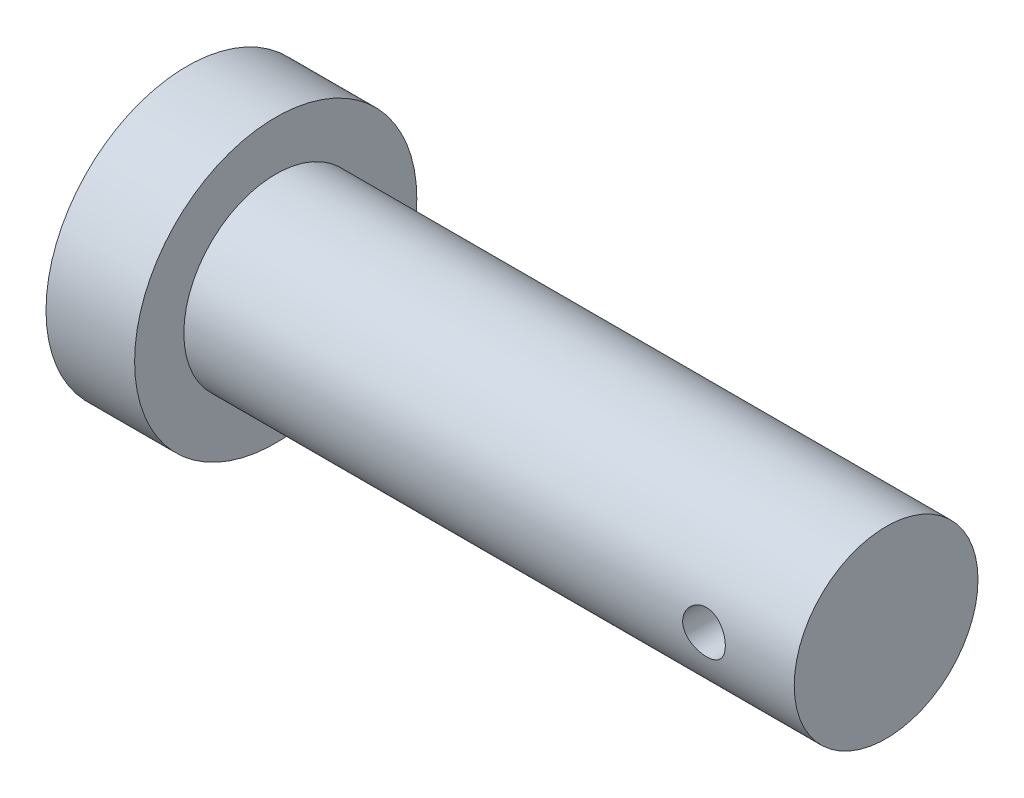
ISO-10303-21;
HEADER;
FILE_DESCRIPTION(('STEP AP214'),'2;1');
FILE_NAME('part.step','',(''),(''),'','','');
FILE_SCHEMA(('AUTOMOTIVE_DESIGN { 1 0 10303 214 1 1 1 1 }'));
ENDSEC;
DATA;
#1=APPLICATION_CONTEXT('core data for automotive mechanical design processes');
#2=APPLICATION_PROTOCOL_DEFINITION('international standard','automotive_design',2000,#1);
#3=PRODUCT_CONTEXT('',#1,'mechanical');
#4=PRODUCT('Part','Part','',(#3));
#5=PRODUCT_RELATED_PRODUCT_CATEGORY('part','',(#4));
#6=PRODUCT_DEFINITION_FORMATION('','',#4);
#7=PRODUCT_DEFINITION_CONTEXT('part definition',#1,'design');
#8=PRODUCT_DEFINITION('design','',#6,#7);
#9=PRODUCT_DEFINITION_SHAPE('','',#8);
#10=(LENGTH_UNIT() NAMED_UNIT(*) SI_UNIT(.MILLI.,.METRE.));
#11=(NAMED_UNIT(*) PLANE_ANGLE_UNIT() SI_UNIT($,.RADIAN.));
#12=(NAMED_UNIT(*) SI_UNIT($,.STERADIAN.) SOLID_ANGLE_UNIT());
#13=UNCERTAINTY_MEASURE_WITH_UNIT(LENGTH_MEASURE(1.E-05),#10,'distance_accuracy_value','');
#14=(GEOMETRIC_REPRESENTATION_CONTEXT(3) GLOBAL_UNCERTAINTY_ASSIGNED_CONTEXT((#13)) GLOBAL_UNIT_ASSIGNED_CONTEXT((#10,
#11,#12)) REPRESENTATION_CONTEXT('',''));
#15=CARTESIAN_POINT('',(0.,0.,0.));
#16=DIRECTION('',(0.,0.,1.));
#17=DIRECTION('',(1.,0.,0.));
#18=AXIS2_PLACEMENT_3D('',#15,#16,#17);
#19=CARTESIAN_POINT('',(0.,0.,0.));
#20=DIRECTION('',(1.,0.,0.));
#21=DIRECTION('',(0.,0.,-1.));
#22=AXIS2_PLACEMENT_3D('',#19,#20,#21);
#23=PLANE('',#22);
#24=CARTESIAN_POINT('',(0.,0.,0.));
#25=DIRECTION('',(-1.,0.,0.));
#26=DIRECTION('',(0.,0.,1.));
#27=AXIS2_PLACEMENT_3D('',#24,#25,#26);
#28=CIRCLE('',#27,43.);
#29=CARTESIAN_POINT('',(0.,0.,43.));
#30=VERTEX_POINT('',#29);
#31=EDGE_CURVE('E10',#30,#30,#28,.T.);
#32=ORIENTED_EDGE('',*,*,#31,.T.);
#33=EDGE_LOOP('',(#32));
#34=FACE_BOUND('',#33,.T.);
#35=ADVANCED_FACE('F31',(#34),#23,.F.);
#36=CARTESIAN_POINT('',(0.,0.,0.));
#37=DIRECTION('',(-1.,0.,0.));
#38=DIRECTION('',(0.,0.,1.));
#39=AXIS2_PLACEMENT_3D('',#36,#37,#38);
#40=CYLINDRICAL_SURFACE('',#39,43.);
#41=ORIENTED_EDGE('',*,*,#31,.F.);
#42=EDGE_LOOP('',(#41));
#43=FACE_BOUND('',#42,.T.);
#44=CARTESIAN_POINT('',(27.,0.,0.));
#45=DIRECTION('',(-1.,0.,0.));
#46=DIRECTION('',(0.,0.,1.));
#47=AXIS2_PLACEMENT_3D('',#44,#45,#46);
#48=CIRCLE('',#47,43.);
#49=CARTESIAN_POINT('',(27.,0.,43.));
#50=VERTEX_POINT('',#49);
#51=EDGE_CURVE('E43',#50,#50,#48,.T.);
#52=ORIENTED_EDGE('',*,*,#51,.T.);
#53=EDGE_LOOP('',(#52));
#54=FACE_BOUND('',#53,.T.);
#55=ADVANCED_FACE('F75',(#43,#54),#40,.T.);
#56=CARTESIAN_POINT('',(27.,43.,0.));
#57=DIRECTION('',(-1.,0.,0.));
#58=DIRECTION('',(0.,0.,1.));
#59=AXIS2_PLACEMENT_3D('',#56,#57,#58);
#60=PLANE('',#59);
#61=ORIENTED_EDGE('',*,*,#51,.F.);
#62=EDGE_LOOP('',(#61));
#63=FACE_BOUND('',#62,.T.);
#64=CARTESIAN_POINT('',(27.,0.,0.));
#65=DIRECTION('',(-1.,0.,0.));
#66=DIRECTION('',(0.,0.,1.));
#67=AXIS2_PLACEMENT_3D('',#64,#65,#66);
#68=CIRCLE('',#67,28.);
#69=CARTESIAN_POINT('',(27.,0.,28.));
#70=VERTEX_POINT('',#69);
#71=EDGE_CURVE('E48',#70,#70,#68,.T.);
#72=ORIENTED_EDGE('',*,*,#71,.T.);
#73=EDGE_LOOP('',(#72));
#74=FACE_BOUND('',#73,.T.);
#75=ADVANCED_FACE('F71',(#63,#74),#60,.F.);
#76=CARTESIAN_POINT('',(0.,0.,0.));
#77=DIRECTION('',(-1.,0.,0.));
#78=DIRECTION('',(0.,0.,1.));
#79=AXIS2_PLACEMENT_3D('',#76,#77,#78);
#80=CYLINDRICAL_SURFACE('',#79,28.);
#81=CARTESIAN_POINT('',(192.,0.,28.));
#82=CARTESIAN_POINT('',(192.000004643381,-0.180027245318156,28.00000265752));
#83=CARTESIAN_POINT('',(191.992519375118,-0.360001044580009,27.9982610130662));
#84=CARTESIAN_POINT('',(191.962650146657,-0.718693840889645,27.9913488920916));
#85=CARTESIAN_POINT('',(191.940264172767,-0.897412665040001,27.986177952134));
#86=CARTESIAN_POINT('',(191.880760282105,-1.25231567602568,27.9725449434592));
#87=CARTESIAN_POINT('',(191.843636640699,-1.42849885033457,27.9640815958795));
#88=CARTESIAN_POINT('',(191.754944489248,-1.77708276845839,27.9440953238526));
#89=CARTESIAN_POINT('',(191.703370660856,-1.94948209439992,27.9325712730041));
#90=CARTESIAN_POINT('',(191.586278913355,-2.28897439474337,27.9068009175937));
#91=CARTESIAN_POINT('',(191.520782030266,-2.45607494207955,27.8925587230928));
#92=CARTESIAN_POINT('',(191.376269179383,-2.78417052160912,27.8617220765635));
#93=CARTESIAN_POINT('',(191.297248222661,-2.9451632738131,27.8451267568739));
#94=CARTESIAN_POINT('',(191.126314902076,-3.25985127409999,27.8100418662322));
#95=CARTESIAN_POINT('',(191.034407628474,-3.41354937173257,27.7915530440115));
#96=CARTESIAN_POINT('',(190.838286594858,-3.71277649305698,27.7531629933942));
#97=CARTESIAN_POINT('',(190.734068220882,-3.8583024236397,27.7332612365791));
#98=CARTESIAN_POINT('',(190.512325347449,-4.14241171542875,27.6922615699802));
#99=CARTESIAN_POINT('',(190.394617341229,-4.28084987537008,27.6711497697155));
#100=CARTESIAN_POINT('',(190.148011995174,-4.54741299753386,27.6285950276546));
#101=CARTESIAN_POINT('',(190.01911052173,-4.6755341158487,27.6071519659514));
#102=CARTESIAN_POINT('',(189.751046475708,-4.92052477533225,27.5645405384539));
#103=CARTESIAN_POINT('',(189.611886658962,-5.03739731904118,27.5433721006679));
#104=CARTESIAN_POINT('',(189.324138112659,-5.25918030798559,27.5018864524273));
#105=CARTESIAN_POINT('',(189.175545922821,-5.36408632334614,27.4815695589541));
#106=CARTESIAN_POINT('',(188.868080060831,-5.5623649703166,27.4421290035801));
#107=CARTESIAN_POINT('',(188.709102647796,-5.65558038251708,27.4230230307116));
#108=CARTESIAN_POINT('',(188.383568296796,-5.82829356194015,27.3868359294438));
#109=CARTESIAN_POINT('',(188.217008530816,-5.90778615705749,27.3697555652487));
#110=CARTESIAN_POINT('',(187.877585585712,-6.05236061561985,27.3381496164885));
#111=CARTESIAN_POINT('',(187.704725458955,-6.11744935206738,27.3236228141392));
#112=CARTESIAN_POINT('',(187.353898231557,-6.23275606327715,27.2975491447538));
#113=CARTESIAN_POINT('',(187.17592931783,-6.28296868517562,27.2860033505638));
#114=CARTESIAN_POINT('',(186.642555498939,-6.40905440400683,27.2567759111147));
#115=CARTESIAN_POINT('',(186.281316062767,-6.46307571342094,27.243892017442));
#116=CARTESIAN_POINT('',(185.736943694955,-6.49824201338445,27.2355059851615));
#117=CARTESIAN_POINT('',(185.554995466527,-6.50231241887855,27.234535711796));
#118=CARTESIAN_POINT('',(185.191391199971,-6.49521351017516,27.2362300229218));
#119=CARTESIAN_POINT('',(185.009735165384,-6.48404401273551,27.2388946511186));
#120=CARTESIAN_POINT('',(184.47482992371,-6.42849012663147,27.2520873365656));
#121=CARTESIAN_POINT('',(184.123702967191,-6.36255085088355,27.2676997868963));
#122=CARTESIAN_POINT('',(183.437821490617,-6.17446976690527,27.3108959627634));
#123=CARTESIAN_POINT('',(183.103067993896,-6.05232445077009,27.3384804354858));
#124=CARTESIAN_POINT('',(182.455766583687,-5.75418763581062,27.402786196796));
#125=CARTESIAN_POINT('',(182.143441648592,-5.57772872364258,27.4395862595726));
#126=CARTESIAN_POINT('',(181.552393935023,-5.1763022508112,27.5181321957449));
#127=CARTESIAN_POINT('',(181.273676290531,-4.95132729324554,27.559878822871));
#128=CARTESIAN_POINT('',(180.750584895174,-4.45272435402121,27.6448659281071));
#129=CARTESIAN_POINT('',(180.50721761161,-4.17804118585769,27.6881179730259));
#130=CARTESIAN_POINT('',(180.069827332986,-3.59125787604078,27.7703168417923));
#131=CARTESIAN_POINT('',(179.87580546496,-3.27915688001657,27.8092635672964));
#132=CARTESIAN_POINT('',(179.542314279968,-2.62508316643675,27.8786161687093));
#133=CARTESIAN_POINT('',(179.402989881082,-2.28303399278546,27.9089992966087));
#134=CARTESIAN_POINT('',(179.184084192031,-1.57951308793368,27.9576341273381));
#135=CARTESIAN_POINT('',(179.104493087896,-1.21804455772724,27.9758878229347));
#136=CARTESIAN_POINT('',(179.008807360687,-0.494567894343217,27.9979187705354));
#137=CARTESIAN_POINT('',(178.991339586174,-0.132750649555291,28.0020090313775));
#138=CARTESIAN_POINT('',(179.016656297791,0.58863336680594,27.9961353213746));
#139=CARTESIAN_POINT('',(179.059436150183,0.948200309317139,27.9861724313794));
#140=CARTESIAN_POINT('',(179.202897186808,1.65023527726955,27.9535107046663));
#141=CARTESIAN_POINT('',(179.302846174988,1.99286109650118,27.9309730082346));
#142=CARTESIAN_POINT('',(179.556987115645,2.65647781072147,27.8756901043829));
#143=CARTESIAN_POINT('',(179.711184071074,2.97746670701715,27.8429439555329));
#144=CARTESIAN_POINT('',(180.072216915253,3.59428635375457,27.7701128619166));
#145=CARTESIAN_POINT('',(180.279843921291,3.88964101325959,27.7299204140028));
#146=CARTESIAN_POINT('',(180.740832148208,4.44181107455223,27.646851848169));
#147=CARTESIAN_POINT('',(180.994200114193,4.69862078213727,27.6039753350583));
#148=CARTESIAN_POINT('',(181.545745110184,5.17191782764256,27.5192729101974));
#149=CARTESIAN_POINT('',(181.844749170253,5.3874484682229,27.477487784204));
#150=CARTESIAN_POINT('',(182.47571577416,5.76530058581141,27.4007063243137));
#151=CARTESIAN_POINT('',(182.807676848841,5.92762443328516,27.3657096880047));
#152=CARTESIAN_POINT('',(183.321886177139,6.12695137681363,27.3215109986901));
#153=CARTESIAN_POINT('',(183.495559746442,6.18594383225918,27.3081831770024));
#154=CARTESIAN_POINT('',(183.847447044401,6.28908725840163,27.2846148761274));
#155=CARTESIAN_POINT('',(184.025659046878,6.33324378382068,27.2743732415888));
#156=CARTESIAN_POINT('',(184.385334101222,6.40634190498579,27.2572960568768));
#157=CARTESIAN_POINT('',(184.566797295423,6.43528283291829,27.2504606562038));
#158=CARTESIAN_POINT('',(184.931619327463,6.47770471304748,27.2404078690826));
#159=CARTESIAN_POINT('',(185.114978083365,6.49118633068157,27.2371903269058));
#160=CARTESIAN_POINT('',(185.477670593815,6.50243076621494,27.234507965787));
#161=CARTESIAN_POINT('',(185.656992041265,6.50057319217515,27.2349525181529));
#162=CARTESIAN_POINT('',(186.014822539856,6.48205617050262,27.2393656037165));
#163=CARTESIAN_POINT('',(186.193331608074,6.46539703545044,27.2433340624962));
#164=CARTESIAN_POINT('',(186.548285082372,6.41741210326959,27.2546771736462));
#165=CARTESIAN_POINT('',(186.724729154144,6.38608396409551,27.2620523699319));
#166=CARTESIAN_POINT('',(187.074212451187,6.30903028878458,27.2799871419267));
#167=CARTESIAN_POINT('',(187.24725285826,6.26330984708917,27.2905455908045));
#168=CARTESIAN_POINT('',(187.588093288179,6.15804758536236,27.3144897046096));
#169=CARTESIAN_POINT('',(187.755911873136,6.09856314711223,27.3278636116355));
#170=CARTESIAN_POINT('',(188.085863386026,5.96614622954108,27.3570775299882));
#171=CARTESIAN_POINT('',(188.247998276863,5.89321844853129,27.3729166794379));
#172=CARTESIAN_POINT('',(188.565654751934,5.7343968902868,27.406628423304));
#173=CARTESIAN_POINT('',(188.721173404539,5.64849744049744,27.4245019064952));
#174=CARTESIAN_POINT('',(189.024475977834,5.46438762202107,27.4617785795486));
#175=CARTESIAN_POINT('',(189.172262456711,5.36618136201947,27.4811812580834));
#176=CARTESIAN_POINT('',(189.462535751151,5.15569456157473,27.5214562497379));
#177=CARTESIAN_POINT('',(189.604822057643,5.04314191825611,27.5423521212845));
#178=CARTESIAN_POINT('',(189.879405636729,4.80662358317749,27.5846115133382));
#179=CARTESIAN_POINT('',(190.011706331437,4.68266183399093,27.6059748703686));
#180=CARTESIAN_POINT('',(190.265579445835,4.42403727257116,27.6485998848915));
#181=CARTESIAN_POINT('',(190.387145486494,4.2893681866679,27.6698614749064));
#182=CARTESIAN_POINT('',(190.618604378177,4.01032877464235,27.7116790449871));
#183=CARTESIAN_POINT('',(190.728501482721,3.8659620150282,27.7322352803042));
#184=CARTESIAN_POINT('',(190.937520901922,3.56612882485039,27.7723954355585));
#185=CARTESIAN_POINT('',(191.036450669045,3.41052543803633,27.7919797528384));
#186=CARTESIAN_POINT('',(191.220785524592,3.09136915379151,27.8292874632277));
#187=CARTESIAN_POINT('',(191.306195592623,2.92781921239862,27.8470115406907));
#188=CARTESIAN_POINT('',(191.462844859441,2.59392750924291,27.8800941918594));
#189=CARTESIAN_POINT('',(191.534091129552,2.4235891878537,27.895453945093));
#190=CARTESIAN_POINT('',(191.661883536966,2.07732204508602,27.9233761936784));
#191=CARTESIAN_POINT('',(191.718432130642,1.90139416339374,27.9359391563976));
#192=CARTESIAN_POINT('',(191.844360036751,1.44335048369214,27.9641763754208));
#193=CARTESIAN_POINT('',(191.902632395915,1.15795401118641,27.9775319789036));
#194=CARTESIAN_POINT('',(191.980447547838,0.581658349196943,27.9954413996945));
#195=CARTESIAN_POINT('',(191.999992500541,0.290759467512732,27.9999957078769));
#196=CARTESIAN_POINT('',(192.,0.,28.));
#197=B_SPLINE_CURVE_WITH_KNOTS('',3,(#81,#82,#83,#84,#85,#86,#87,#88,#89,#90,#91,#92,#93,#94,
#95,#96,#97,#98,#99,#100,#101,#102,#103,#104,#105,#106,#107,#108,#109,#110,#111,#112,#113,#114,
#115,#116,#117,#118,#119,#120,#121,#122,#123,#124,#125,#126,#127,#128,#129,#130,#131,#132,#133,
#134,#135,#136,#137,#138,#139,#140,#141,#142,#143,#144,#145,#146,#147,#148,#149,#150,#151,#152,
#153,#154,#155,#156,#157,#158,#159,#160,#161,#162,#163,#164,#165,#166,#167,#168,#169,#170,#171,
#172,#173,#174,#175,#176,#177,#178,#179,#180,#181,#182,#183,#184,#185,#186,#187,#188,#189,#190,
#191,#192,#193,#194,#195,#196),.UNSPECIFIED.,.T.,.F.,(4,2,2,2,2,2,2,2,2,2,2,2,2,2,2,2,2,2,2,2,2,
2,2,2,2,2,2,2,2,2,2,2,2,2,2,2,2,2,2,2,2,2,2,2,2,2,2,2,2,2,2,2,2,2,2,2,2,4),(0.,
0.539825873770573,1.07972471477917,1.61983347721002,2.16014128676357,2.69963848732381,
3.23933513493116,3.778819192869,4.31850608431548,4.86668162966406,5.41506047743335,
5.96329254014201,6.51172689807552,7.06688708114489,7.62225604842447,8.17735943947969,
8.73266233114451,9.8226999916037,10.3681471357939,10.9136008384117,11.9809527965652,
13.0483713788218,14.1252457308571,15.2022843826205,16.3056597948736,17.4090604055792,
18.5153650017633,19.6214877961751,20.7030038359164,21.7844366991162,22.8523196506818,
23.9203011122576,25.0051100895272,26.09007916701,27.1977619755908,28.3053954280496,
28.8565446866439,29.4074873588297,29.9584542099071,30.5093973440326,31.0467476019514,
31.5840865123336,32.1215112432292,32.6587459554679,33.1937800652442,33.7286275393547,
34.2637095850401,34.7986134646666,35.3458394807831,35.8928771003838,36.440237637717,
36.9873979631637,37.5430059038146,38.0984087230751,38.6535335553817,39.2085655518808,
40.080479345633,40.9523445087628),.UNSPECIFIED.);
#198=CARTESIAN_POINT('',(192.,0.,28.));
#199=VERTEX_POINT('',#198);
#200=EDGE_CURVE('E34',#199,#199,#197,.T.);
#201=ORIENTED_EDGE('',*,*,#200,.T.);
#202=EDGE_LOOP('',(#201));
#203=FACE_BOUND('',#202,.T.);
#204=CARTESIAN_POINT('',(192.,0.,-28.));
#205=CARTESIAN_POINT('',(192.000004643381,0.180027245318178,-28.00000265752));
#206=CARTESIAN_POINT('',(191.992519375118,0.36000104458003,-27.9982610130662));
#207=CARTESIAN_POINT('',(191.962650146657,0.718693840889667,-27.9913488920916));
#208=CARTESIAN_POINT('',(191.940264172767,0.897412665040023,-27.986177952134));
#209=CARTESIAN_POINT('',(191.880760282105,1.2523156760257,-27.9725449434592));
#210=CARTESIAN_POINT('',(191.843636640699,1.42849885033459,-27.9640815958795));
#211=CARTESIAN_POINT('',(191.754944489248,1.77708276845841,-27.9440953238526));
#212=CARTESIAN_POINT('',(191.703370660856,1.94948209439995,-27.9325712730041));
#213=CARTESIAN_POINT('',(191.586278913355,2.2889743947434,-27.9068009175937));
#214=CARTESIAN_POINT('',(191.520782030266,2.45607494207957,-27.8925587230928));
#215=CARTESIAN_POINT('',(191.376269179383,2.78417052160914,-27.8617220765635));
#216=CARTESIAN_POINT('',(191.297248222661,2.94516327381313,-27.8451267568739));
#217=CARTESIAN_POINT('',(191.126314902076,3.25985127410002,-27.8100418662322));
#218=CARTESIAN_POINT('',(191.034407628474,3.41354937173259,-27.7915530440115));
#219=CARTESIAN_POINT('',(190.838286594858,3.712776493057,-27.7531629933942));
#220=CARTESIAN_POINT('',(190.734068220882,3.85830242363972,-27.7332612365791));
#221=CARTESIAN_POINT('',(190.512325347449,4.14241171542878,-27.6922615699802));
#222=CARTESIAN_POINT('',(190.394617341229,4.28084987537009,-27.6711497697155));
#223=CARTESIAN_POINT('',(190.148011995174,4.54741299753387,-27.6285950276546));
#224=CARTESIAN_POINT('',(190.01911052173,4.67553411584872,-27.6071519659514));
#225=CARTESIAN_POINT('',(189.751046475708,4.92052477533228,-27.5645405384539));
#226=CARTESIAN_POINT('',(189.611886658962,5.0373973190412,-27.5433721006679));
#227=CARTESIAN_POINT('',(189.324138112659,5.25918030798561,-27.5018864524273));
#228=CARTESIAN_POINT('',(189.175545922821,5.36408632334616,-27.4815695589541));
#229=CARTESIAN_POINT('',(188.868080060831,5.56236497031663,-27.4421290035801));
#230=CARTESIAN_POINT('',(188.709102647796,5.65558038251712,-27.4230230307116));
#231=CARTESIAN_POINT('',(188.383568296796,5.8282935619402,-27.3868359294438));
#232=CARTESIAN_POINT('',(188.217008530816,5.90778615705753,-27.3697555652487));
#233=CARTESIAN_POINT('',(187.877585585712,6.05236061561989,-27.3381496164885));
#234=CARTESIAN_POINT('',(187.704725458955,6.11744935206742,-27.3236228141392));
#235=CARTESIAN_POINT('',(187.353898231557,6.23275606327719,-27.2975491447538));
#236=CARTESIAN_POINT('',(187.17592931783,6.28296868517566,-27.2860033505638));
#237=CARTESIAN_POINT('',(186.642555498939,6.40905440400686,-27.2567759111147));
#238=CARTESIAN_POINT('',(186.281316062767,6.46307571342098,-27.243892017442));
#239=CARTESIAN_POINT('',(185.736943694955,6.4982420133845,-27.2355059851615));
#240=CARTESIAN_POINT('',(185.554995466527,6.50231241887859,-27.234535711796));
#241=CARTESIAN_POINT('',(185.191391199971,6.4952135101752,-27.2362300229218));
#242=CARTESIAN_POINT('',(185.009735165384,6.48404401273555,-27.2388946511186));
#243=CARTESIAN_POINT('',(184.47482992371,6.42849012663152,-27.2520873365656));
#244=CARTESIAN_POINT('',(184.123702967191,6.36255085088359,-27.2676997868963));
#245=CARTESIAN_POINT('',(183.437821490617,6.17446976690532,-27.3108959627633));
#246=CARTESIAN_POINT('',(183.103067993896,6.05232445077014,-27.3384804354858));
#247=CARTESIAN_POINT('',(182.455766583687,5.75418763581068,-27.402786196796));
#248=CARTESIAN_POINT('',(182.143441648592,5.57772872364264,-27.4395862595726));
#249=CARTESIAN_POINT('',(181.552393935023,5.17630225081127,-27.5181321957449));
#250=CARTESIAN_POINT('',(181.273676290531,4.9513272932456,-27.559878822871));
#251=CARTESIAN_POINT('',(180.750584895174,4.45272435402128,-27.644865928107));
#252=CARTESIAN_POINT('',(180.50721761161,4.17804118585775,-27.6881179730259));
#253=CARTESIAN_POINT('',(180.069827332986,3.59125787604083,-27.7703168417923));
#254=CARTESIAN_POINT('',(179.87580546496,3.27915688001662,-27.8092635672964));
#255=CARTESIAN_POINT('',(179.542314279968,2.6250831664368,-27.8786161687093));
#256=CARTESIAN_POINT('',(179.402989881082,2.28303399278551,-27.9089992966087));
#257=CARTESIAN_POINT('',(179.184084192031,1.57951308793374,-27.9576341273381));
#258=CARTESIAN_POINT('',(179.104493087896,1.2180445577273,-27.9758878229347));
#259=CARTESIAN_POINT('',(179.008807360687,0.494567894343278,-27.9979187705354));
#260=CARTESIAN_POINT('',(178.991339586174,0.132750649555351,-28.0020090313775));
#261=CARTESIAN_POINT('',(179.016656297791,-0.588633366805879,-27.9961353213747));
#262=CARTESIAN_POINT('',(179.059436150183,-0.948200309317075,-27.9861724313794));
#263=CARTESIAN_POINT('',(179.202897186808,-1.65023527726949,-27.9535107046663));
#264=CARTESIAN_POINT('',(179.302846174988,-1.99286109650112,-27.9309730082346));
#265=CARTESIAN_POINT('',(179.556987115645,-2.65647781072141,-27.8756901043829));
#266=CARTESIAN_POINT('',(179.711184071074,-2.97746670701708,-27.8429439555329));
#267=CARTESIAN_POINT('',(180.072216915253,-3.5942863537545,-27.7701128619166));
#268=CARTESIAN_POINT('',(180.279843921291,-3.88964101325953,-27.7299204140028));
#269=CARTESIAN_POINT('',(180.740832148208,-4.44181107455218,-27.646851848169));
#270=CARTESIAN_POINT('',(180.994200114193,-4.69862078213722,-27.6039753350583));
#271=CARTESIAN_POINT('',(181.545745110184,-5.17191782764252,-27.5192729101974));
#272=CARTESIAN_POINT('',(181.844749170253,-5.38744846822286,-27.477487784204));
#273=CARTESIAN_POINT('',(182.47571577416,-5.76530058581136,-27.4007063243137));
#274=CARTESIAN_POINT('',(182.807676848841,-5.9276244332851,-27.3657096880047));
#275=CARTESIAN_POINT('',(183.321886177139,-6.12695137681358,-27.3215109986901));
#276=CARTESIAN_POINT('',(183.495559746442,-6.18594383225913,-27.3081831770024));
#277=CARTESIAN_POINT('',(183.847447044401,-6.28908725840158,-27.2846148761274));
#278=CARTESIAN_POINT('',(184.025659046878,-6.33324378382062,-27.2743732415888));
#279=CARTESIAN_POINT('',(184.385334101222,-6.40634190498573,-27.2572960568768));
#280=CARTESIAN_POINT('',(184.566797295423,-6.43528283291824,-27.2504606562038));
#281=CARTESIAN_POINT('',(184.931619327463,-6.47770471304742,-27.2404078690826));
#282=CARTESIAN_POINT('',(185.114978083365,-6.49118633068152,-27.2371903269058));
#283=CARTESIAN_POINT('',(185.477670593815,-6.50243076621489,-27.234507965787));
#284=CARTESIAN_POINT('',(185.656992041265,-6.5005731921751,-27.2349525181529));
#285=CARTESIAN_POINT('',(186.014822539856,-6.48205617050257,-27.2393656037165));
#286=CARTESIAN_POINT('',(186.193331608074,-6.46539703545039,-27.2433340624962));
#287=CARTESIAN_POINT('',(186.548285082372,-6.41741210326954,-27.2546771736462));
#288=CARTESIAN_POINT('',(186.724729154144,-6.38608396409547,-27.2620523699319));
#289=CARTESIAN_POINT('',(187.074212451187,-6.30903028878453,-27.2799871419267));
#290=CARTESIAN_POINT('',(187.24725285826,-6.26330984708913,-27.2905455908046));
#291=CARTESIAN_POINT('',(187.588093288179,-6.15804758536232,-27.3144897046097));
#292=CARTESIAN_POINT('',(187.755911873136,-6.09856314711219,-27.3278636116355));
#293=CARTESIAN_POINT('',(188.085863386026,-5.96614622954103,-27.3570775299882));
#294=CARTESIAN_POINT('',(188.247998276863,-5.89321844853125,-27.3729166794379));
#295=CARTESIAN_POINT('',(188.565654751934,-5.73439689028675,-27.406628423304));
#296=CARTESIAN_POINT('',(188.721173404539,-5.6484974404974,-27.4245019064952));
#297=CARTESIAN_POINT('',(189.024475977834,-5.46438762202103,-27.4617785795486));
#298=CARTESIAN_POINT('',(189.172262456711,-5.36618136201942,-27.4811812580835));
#299=CARTESIAN_POINT('',(189.462535751151,-5.15569456157468,-27.5214562497379));
#300=CARTESIAN_POINT('',(189.604822057643,-5.04314191825606,-27.5423521212845));
#301=CARTESIAN_POINT('',(189.879405636729,-4.80662358317744,-27.5846115133382));
#302=CARTESIAN_POINT('',(190.011706331437,-4.68266183399089,-27.6059748703686));
#303=CARTESIAN_POINT('',(190.265579445835,-4.42403727257112,-27.6485998848915));
#304=CARTESIAN_POINT('',(190.387145486494,-4.28936818666786,-27.6698614749064));
#305=CARTESIAN_POINT('',(190.618604378177,-4.01032877464231,-27.7116790449871));
#306=CARTESIAN_POINT('',(190.728501482721,-3.86596201502816,-27.7322352803042));
#307=CARTESIAN_POINT('',(190.937520901922,-3.56612882485035,-27.7723954355585));
#308=CARTESIAN_POINT('',(191.036450669045,-3.41052543803629,-27.7919797528384));
#309=CARTESIAN_POINT('',(191.220785524592,-3.09136915379147,-27.8292874632277));
#310=CARTESIAN_POINT('',(191.306195592623,-2.92781921239858,-27.8470115406907));
#311=CARTESIAN_POINT('',(191.462844859441,-2.59392750924287,-27.8800941918594));
#312=CARTESIAN_POINT('',(191.534091129552,-2.42358918785366,-27.895453945093));
#313=CARTESIAN_POINT('',(191.661883536966,-2.07732204508598,-27.9233761936784));
#314=CARTESIAN_POINT('',(191.718432130642,-1.9013941633937,-27.9359391563976));
#315=CARTESIAN_POINT('',(191.844360036751,-1.4433504836921,-27.9641763754208));
#316=CARTESIAN_POINT('',(191.902632395915,-1.15795401118638,-27.9775319789036));
#317=CARTESIAN_POINT('',(191.980447547838,-0.581658349196917,-27.9954413996945));
#318=CARTESIAN_POINT('',(191.999992500541,-0.290759467512708,-27.9999957078769));
#319=CARTESIAN_POINT('',(192.,0.,-28.));
#320=B_SPLINE_CURVE_WITH_KNOTS('',3,(#204,#205,#206,#207,#208,#209,#210,#211,#212,#213,#214,
#215,#216,#217,#218,#219,#220,#221,#222,#223,#224,#225,#226,#227,#228,#229,#230,#231,#232,#233,
#234,#235,#236,#237,#238,#239,#240,#241,#242,#243,#244,#245,#246,#247,#248,#249,#250,#251,#252,
#253,#254,#255,#256,#257,#258,#259,#260,#261,#262,#263,#264,#265,#266,#267,#268,#269,#270,#271,
#272,#273,#274,#275,#276,#277,#278,#279,#280,#281,#282,#283,#284,#285,#286,#287,#288,#289,#290,
#291,#292,#293,#294,#295,#296,#297,#298,#299,#300,#301,#302,#303,#304,#305,#306,#307,#308,#309,
#310,#311,#312,#313,#314,#315,#316,#317,#318,#319),.UNSPECIFIED.,.T.,.F.,(4,2,2,2,2,2,2,2,2,2,2,
2,2,2,2,2,2,2,2,2,2,2,2,2,2,2,2,2,2,2,2,2,2,2,2,2,2,2,2,2,2,2,2,2,2,2,2,2,2,2,2,2,2,2,2,2,2,4),
(0.,0.539825873770572,1.07972471477917,1.61983347721002,2.16014128676357,2.6996384873238,
3.23933513493117,3.778819192869,4.31850608431547,4.86668162966404,5.41506047743334,
5.963292540142,6.51172689807553,7.06688708114491,7.62225604842449,8.17735943947968,
8.7326623311445,9.82269999160367,10.3681471357939,10.9136008384117,11.9809527965653,
13.0483713788218,14.1252457308571,15.2022843826205,16.3056597948736,17.4090604055792,
18.5153650017633,19.6214877961752,20.7030038359164,21.7844366991162,22.8523196506818,
23.9203011122576,25.0051100895272,26.0900791670101,27.1977619755908,28.3053954280496,
28.8565446866439,29.4074873588297,29.9584542099071,30.5093973440326,31.0467476019514,
31.5840865123337,32.1215112432293,32.6587459554679,33.1937800652442,33.7286275393548,
34.2637095850402,34.7986134646667,35.3458394807832,35.8928771003838,36.440237637717,
36.9873979631637,37.5430059038146,38.0984087230752,38.6535335553818,39.2085655518809,
40.080479345633,40.9523445087629),.UNSPECIFIED.);
#321=CARTESIAN_POINT('',(192.,0.,-28.));
#322=VERTEX_POINT('',#321);
#323=EDGE_CURVE('E51',#322,#322,#320,.T.);
#324=ORIENTED_EDGE('',*,*,#323,.T.);
#325=EDGE_LOOP('',(#324));
#326=FACE_BOUND('',#325,.T.);
#327=ORIENTED_EDGE('',*,*,#71,.F.);
#328=EDGE_LOOP('',(#327));
#329=FACE_BOUND('',#328,.T.);
#330=CARTESIAN_POINT('',(213.,0.,0.));
#331=DIRECTION('',(-1.,0.,0.));
#332=DIRECTION('',(0.,0.,1.));
#333=AXIS2_PLACEMENT_3D('',#330,#331,#332);
#334=CIRCLE('',#333,28.);
#335=CARTESIAN_POINT('',(213.,0.,28.));
#336=VERTEX_POINT('',#335);
#337=EDGE_CURVE('E90',#336,#336,#334,.T.);
#338=ORIENTED_EDGE('',*,*,#337,.T.);
#339=EDGE_LOOP('',(#338));
#340=FACE_BOUND('',#339,.T.);
#341=ADVANCED_FACE('F56',(#203,#326,#329,#340),#80,.T.);
#342=CARTESIAN_POINT('',(212.999999999984,28.,0.));
#343=DIRECTION('',(-1.,0.,0.));
#344=DIRECTION('',(0.,0.,1.));
#345=AXIS2_PLACEMENT_3D('',#342,#343,#344);
#346=PLANE('',#345);
#347=ORIENTED_EDGE('',*,*,#337,.F.);
#348=EDGE_LOOP('',(#347));
#349=FACE_BOUND('',#348,.T.);
#350=ADVANCED_FACE('F63',(#349),#346,.F.);
#351=CARTESIAN_POINT('',(185.5,0.,-40.));
#352=DIRECTION('',(0.,0.,1.));
#353=DIRECTION('',(1.,0.,0.));
#354=AXIS2_PLACEMENT_3D('',#351,#352,#353);
#355=CYLINDRICAL_SURFACE('',#354,6.50000000000002);
#356=ORIENTED_EDGE('',*,*,#323,.F.);
#357=EDGE_LOOP('',(#356));
#358=FACE_BOUND('',#357,.T.);
#359=ORIENTED_EDGE('',*,*,#200,.F.);
#360=EDGE_LOOP('',(#359));
#361=FACE_BOUND('',#360,.T.);
#362=ADVANCED_FACE('F60',(#358,#361),#355,.F.);
#363=CLOSED_SHELL('',(#35,#55,#75,#341,#350,#362));
#364=MANIFOLD_SOLID_BREP('B2',#363);
#365=ADVANCED_BREP_SHAPE_REPRESENTATION('',(#18,#364),#14);
#366=SHAPE_DEFINITION_REPRESENTATION(#9,#365);
ENDSEC;
END-ISO-10303-21;
